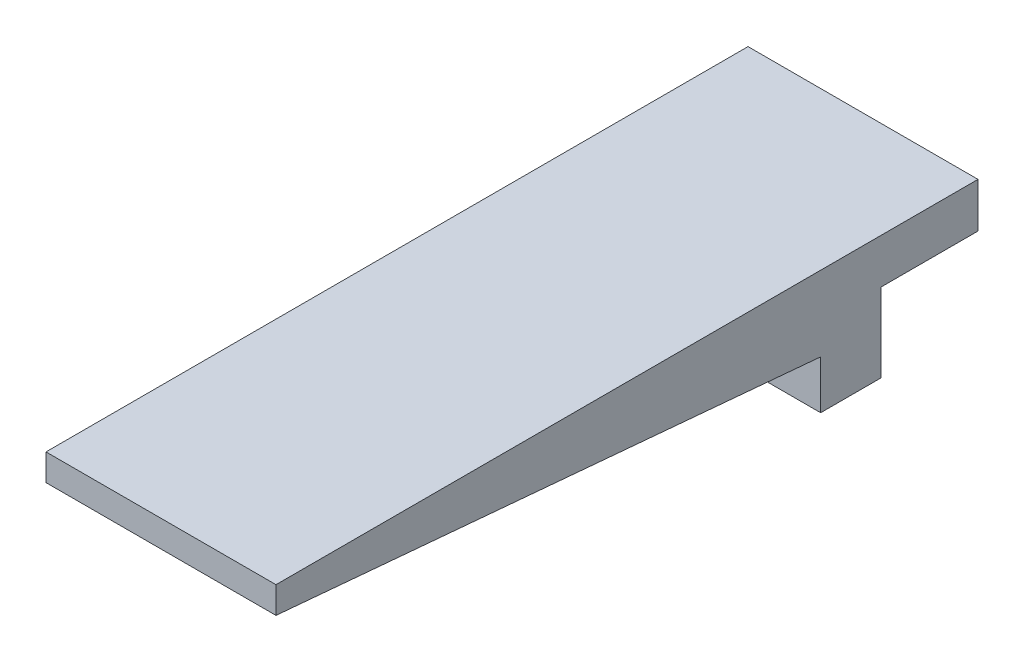
ISO-10303-21;
HEADER;
FILE_DESCRIPTION(('STEP AP214'),'2;1');
FILE_NAME('part.step','',(''),(''),'','','');
FILE_SCHEMA(('AUTOMOTIVE_DESIGN { 1 0 10303 214 1 1 1 1 }'));
ENDSEC;
DATA;
#1=APPLICATION_CONTEXT('core data for automotive mechanical design processes');
#2=APPLICATION_PROTOCOL_DEFINITION('international standard','automotive_design',2000,#1);
#3=PRODUCT_CONTEXT('',#1,'mechanical');
#4=PRODUCT('Part','Part','',(#3));
#5=PRODUCT_RELATED_PRODUCT_CATEGORY('part','',(#4));
#6=PRODUCT_DEFINITION_FORMATION('','',#4);
#7=PRODUCT_DEFINITION_CONTEXT('part definition',#1,'design');
#8=PRODUCT_DEFINITION('design','',#6,#7);
#9=PRODUCT_DEFINITION_SHAPE('','',#8);
#10=(LENGTH_UNIT() NAMED_UNIT(*) SI_UNIT(.MILLI.,.METRE.));
#11=(NAMED_UNIT(*) PLANE_ANGLE_UNIT() SI_UNIT($,.RADIAN.));
#12=(NAMED_UNIT(*) SI_UNIT($,.STERADIAN.) SOLID_ANGLE_UNIT());
#13=UNCERTAINTY_MEASURE_WITH_UNIT(LENGTH_MEASURE(1.E-05),#10,'distance_accuracy_value','');
#14=(GEOMETRIC_REPRESENTATION_CONTEXT(3) GLOBAL_UNCERTAINTY_ASSIGNED_CONTEXT((#13)) GLOBAL_UNIT_ASSIGNED_CONTEXT((#10,
#11,#12)) REPRESENTATION_CONTEXT('',''));
#15=CARTESIAN_POINT('',(0.,0.,0.));
#16=DIRECTION('',(0.,0.,1.));
#17=DIRECTION('',(1.,0.,0.));
#18=AXIS2_PLACEMENT_3D('',#15,#16,#17);
#19=CARTESIAN_POINT('',(9.5,3.25,50.));
#20=DIRECTION('',(-1.,0.,0.));
#21=DIRECTION('',(0.,0.,1.));
#22=AXIS2_PLACEMENT_3D('',#19,#20,#21);
#23=PLANE('',#22);
#24=DIRECTION('',(0.,-0.0885397902837944,-0.996072640692687));
#25=VECTOR('',#24,1.);
#26=CARTESIAN_POINT('',(9.5,4.75,50.));
#27=LINE('',#26,#25);
#28=CARTESIAN_POINT('',(9.5,4.75,50.));
#29=VERTEX_POINT('',#28);
#30=CARTESIAN_POINT('',(9.5,0.75,5.));
#31=VERTEX_POINT('',#30);
#32=EDGE_CURVE('E53',#29,#31,#27,.T.);
#33=ORIENTED_EDGE('',*,*,#32,.T.);
#34=DIRECTION('',(0.,-1.,0.));
#35=VECTOR('',#34,1.);
#36=CARTESIAN_POINT('',(9.5,0.75,5.));
#37=LINE('',#36,#35);
#38=CARTESIAN_POINT('',(9.5,-3.25,5.));
#39=VERTEX_POINT('',#38);
#40=EDGE_CURVE('E105',#31,#39,#37,.T.);
#41=ORIENTED_EDGE('',*,*,#40,.T.);
#42=DIRECTION('',(0.,0.,-1.));
#43=VECTOR('',#42,1.);
#44=CARTESIAN_POINT('',(9.5,-3.25,50.));
#45=LINE('',#44,#43);
#46=CARTESIAN_POINT('',(9.5,-3.25,0.));
#47=VERTEX_POINT('',#46);
#48=EDGE_CURVE('E46',#39,#47,#45,.T.);
#49=ORIENTED_EDGE('',*,*,#48,.T.);
#50=DIRECTION('',(0.,1.,0.));
#51=VECTOR('',#50,1.);
#52=CARTESIAN_POINT('',(9.5,3.25,0.));
#53=LINE('',#52,#51);
#54=CARTESIAN_POINT('',(9.5,3.25,0.));
#55=VERTEX_POINT('',#54);
#56=EDGE_CURVE('E131',#47,#55,#53,.T.);
#57=ORIENTED_EDGE('',*,*,#56,.T.);
#58=DIRECTION('',(0.,0.,-1.));
#59=VECTOR('',#58,1.);
#60=CARTESIAN_POINT('',(9.5,3.25,50.));
#61=LINE('',#60,#59);
#62=CARTESIAN_POINT('',(9.5,3.25,-8.));
#63=VERTEX_POINT('',#62);
#64=EDGE_CURVE('E147',#55,#63,#61,.T.);
#65=ORIENTED_EDGE('',*,*,#64,.T.);
#66=DIRECTION('',(0.,-1.,0.));
#67=VECTOR('',#66,1.);
#68=CARTESIAN_POINT('',(9.5,6.95,-8.));
#69=LINE('',#68,#67);
#70=CARTESIAN_POINT('',(9.5,6.95,-8.));
#71=VERTEX_POINT('',#70);
#72=EDGE_CURVE('E132',#71,#63,#69,.T.);
#73=ORIENTED_EDGE('',*,*,#72,.F.);
#74=DIRECTION('',(0.,0.,-1.));
#75=VECTOR('',#74,1.);
#76=CARTESIAN_POINT('',(9.5,6.95,50.));
#77=LINE('',#76,#75);
#78=CARTESIAN_POINT('',(9.5,6.95,50.));
#79=VERTEX_POINT('',#78);
#80=EDGE_CURVE('E144',#79,#71,#77,.T.);
#81=ORIENTED_EDGE('',*,*,#80,.F.);
#82=DIRECTION('',(0.,1.,0.));
#83=VECTOR('',#82,1.);
#84=CARTESIAN_POINT('',(9.5,3.25,50.));
#85=LINE('',#84,#83);
#86=EDGE_CURVE('E121',#29,#79,#85,.T.);
#87=ORIENTED_EDGE('',*,*,#86,.F.);
#88=EDGE_LOOP('',(#33,#41,#49,#57,#65,#73,#81,#87));
#89=FACE_BOUND('',#88,.T.);
#90=ADVANCED_FACE('F39',(#89),#23,.F.);
#91=CARTESIAN_POINT('',(-9.5,3.25,50.));
#92=DIRECTION('',(1.,0.,0.));
#93=DIRECTION('',(0.,0.,-1.));
#94=AXIS2_PLACEMENT_3D('',#91,#92,#93);
#95=PLANE('',#94);
#96=DIRECTION('',(0.,0.,-1.));
#97=VECTOR('',#96,1.);
#98=CARTESIAN_POINT('',(-9.5,-3.25,50.));
#99=LINE('',#98,#97);
#100=CARTESIAN_POINT('',(-9.5,-3.25,5.));
#101=VERTEX_POINT('',#100);
#102=CARTESIAN_POINT('',(-9.5,-3.25,0.));
#103=VERTEX_POINT('',#102);
#104=EDGE_CURVE('E11',#101,#103,#99,.T.);
#105=ORIENTED_EDGE('',*,*,#104,.F.);
#106=DIRECTION('',(0.,-1.,0.));
#107=VECTOR('',#106,1.);
#108=CARTESIAN_POINT('',(-9.5,0.75,5.));
#109=LINE('',#108,#107);
#110=CARTESIAN_POINT('',(-9.5,0.75,5.));
#111=VERTEX_POINT('',#110);
#112=EDGE_CURVE('E107',#111,#101,#109,.T.);
#113=ORIENTED_EDGE('',*,*,#112,.F.);
#114=DIRECTION('',(0.,-0.0885397902837944,-0.996072640692687));
#115=VECTOR('',#114,1.);
#116=CARTESIAN_POINT('',(-9.5,4.75,50.));
#117=LINE('',#116,#115);
#118=CARTESIAN_POINT('',(-9.5,4.75,50.));
#119=VERTEX_POINT('',#118);
#120=EDGE_CURVE('E113',#119,#111,#117,.T.);
#121=ORIENTED_EDGE('',*,*,#120,.F.);
#122=DIRECTION('',(0.,-1.,0.));
#123=VECTOR('',#122,1.);
#124=CARTESIAN_POINT('',(-9.5,3.25,50.));
#125=LINE('',#124,#123);
#126=CARTESIAN_POINT('',(-9.5,6.95,50.));
#127=VERTEX_POINT('',#126);
#128=EDGE_CURVE('E119',#127,#119,#125,.T.);
#129=ORIENTED_EDGE('',*,*,#128,.F.);
#130=DIRECTION('',(0.,0.,1.));
#131=VECTOR('',#130,1.);
#132=CARTESIAN_POINT('',(-9.5,6.95,50.));
#133=LINE('',#132,#131);
#134=CARTESIAN_POINT('',(-9.5,6.95,-8.));
#135=VERTEX_POINT('',#134);
#136=EDGE_CURVE('E152',#135,#127,#133,.T.);
#137=ORIENTED_EDGE('',*,*,#136,.F.);
#138=DIRECTION('',(0.,-1.,0.));
#139=VECTOR('',#138,1.);
#140=CARTESIAN_POINT('',(-9.5,6.95,-8.));
#141=LINE('',#140,#139);
#142=CARTESIAN_POINT('',(-9.5,3.25,-8.));
#143=VERTEX_POINT('',#142);
#144=EDGE_CURVE('E137',#135,#143,#141,.T.);
#145=ORIENTED_EDGE('',*,*,#144,.T.);
#146=DIRECTION('',(0.,0.,1.));
#147=VECTOR('',#146,1.);
#148=CARTESIAN_POINT('',(-9.5,3.25,50.));
#149=LINE('',#148,#147);
#150=CARTESIAN_POINT('',(-9.5,3.25,0.));
#151=VERTEX_POINT('',#150);
#152=EDGE_CURVE('E141',#143,#151,#149,.T.);
#153=ORIENTED_EDGE('',*,*,#152,.T.);
#154=DIRECTION('',(0.,-1.,0.));
#155=VECTOR('',#154,1.);
#156=CARTESIAN_POINT('',(-9.5,3.25,0.));
#157=LINE('',#156,#155);
#158=EDGE_CURVE('E125',#151,#103,#157,.T.);
#159=ORIENTED_EDGE('',*,*,#158,.T.);
#160=EDGE_LOOP('',(#105,#113,#121,#129,#137,#145,#153,#159));
#161=FACE_BOUND('',#160,.T.);
#162=ADVANCED_FACE('F167',(#161),#95,.F.);
#163=CARTESIAN_POINT('',(-9.5,-3.25,50.));
#164=DIRECTION('',(0.,1.,0.));
#165=DIRECTION('',(0.,0.,1.));
#166=AXIS2_PLACEMENT_3D('',#163,#164,#165);
#167=PLANE('',#166);
#168=ORIENTED_EDGE('',*,*,#48,.F.);
#169=DIRECTION('',(-1.,0.,0.));
#170=VECTOR('',#169,1.);
#171=CARTESIAN_POINT('',(9.5,-3.25,5.));
#172=LINE('',#171,#170);
#173=EDGE_CURVE('E103',#39,#101,#172,.T.);
#174=ORIENTED_EDGE('',*,*,#173,.T.);
#175=ORIENTED_EDGE('',*,*,#104,.T.);
#176=DIRECTION('',(1.,0.,0.));
#177=VECTOR('',#176,1.);
#178=CARTESIAN_POINT('',(-9.5,-3.25,0.));
#179=LINE('',#178,#177);
#180=EDGE_CURVE('E117',#103,#47,#179,.T.);
#181=ORIENTED_EDGE('',*,*,#180,.T.);
#182=EDGE_LOOP('',(#168,#174,#175,#181));
#183=FACE_BOUND('',#182,.T.);
#184=ADVANCED_FACE('F115',(#183),#167,.F.);
#185=CARTESIAN_POINT('',(0.,0.,50.));
#186=DIRECTION('',(0.,0.,1.));
#187=DIRECTION('',(1.,0.,0.));
#188=AXIS2_PLACEMENT_3D('',#185,#186,#187);
#189=PLANE('',#188);
#190=DIRECTION('',(-1.,0.,0.));
#191=VECTOR('',#190,1.);
#192=CARTESIAN_POINT('',(9.5,4.75,50.));
#193=LINE('',#192,#191);
#194=EDGE_CURVE('E110',#29,#119,#193,.T.);
#195=ORIENTED_EDGE('',*,*,#194,.F.);
#196=ORIENTED_EDGE('',*,*,#86,.T.);
#197=DIRECTION('',(1.,0.,0.));
#198=VECTOR('',#197,1.);
#199=CARTESIAN_POINT('',(9.5,6.95,50.));
#200=LINE('',#199,#198);
#201=EDGE_CURVE('E140',#127,#79,#200,.T.);
#202=ORIENTED_EDGE('',*,*,#201,.F.);
#203=ORIENTED_EDGE('',*,*,#128,.T.);
#204=EDGE_LOOP('',(#195,#196,#202,#203));
#205=FACE_BOUND('',#204,.T.);
#206=ADVANCED_FACE('F185',(#205),#189,.T.);
#207=CARTESIAN_POINT('',(0.,0.,0.));
#208=DIRECTION('',(0.,0.,1.));
#209=DIRECTION('',(1.,0.,0.));
#210=AXIS2_PLACEMENT_3D('',#207,#208,#209);
#211=PLANE('',#210);
#212=ORIENTED_EDGE('',*,*,#56,.F.);
#213=ORIENTED_EDGE('',*,*,#180,.F.);
#214=ORIENTED_EDGE('',*,*,#158,.F.);
#215=DIRECTION('',(-1.,0.,0.));
#216=VECTOR('',#215,1.);
#217=CARTESIAN_POINT('',(-9.5,3.25,0.));
#218=LINE('',#217,#216);
#219=EDGE_CURVE('E128',#55,#151,#218,.T.);
#220=ORIENTED_EDGE('',*,*,#219,.F.);
#221=EDGE_LOOP('',(#212,#213,#214,#220));
#222=FACE_BOUND('',#221,.T.);
#223=ADVANCED_FACE('F170',(#222),#211,.F.);
#224=CARTESIAN_POINT('',(0.,3.25,0.));
#225=DIRECTION('',(0.,1.,0.));
#226=DIRECTION('',(0.,0.,1.));
#227=AXIS2_PLACEMENT_3D('',#224,#225,#226);
#228=PLANE('',#227);
#229=ORIENTED_EDGE('',*,*,#64,.F.);
#230=ORIENTED_EDGE('',*,*,#219,.T.);
#231=ORIENTED_EDGE('',*,*,#152,.F.);
#232=DIRECTION('',(-1.,0.,0.));
#233=VECTOR('',#232,1.);
#234=CARTESIAN_POINT('',(9.5,3.25,-8.));
#235=LINE('',#234,#233);
#236=EDGE_CURVE('E145',#63,#143,#235,.T.);
#237=ORIENTED_EDGE('',*,*,#236,.F.);
#238=EDGE_LOOP('',(#229,#230,#231,#237));
#239=FACE_BOUND('',#238,.T.);
#240=ADVANCED_FACE('F175',(#239),#228,.F.);
#241=CARTESIAN_POINT('',(9.5,6.95,-8.));
#242=DIRECTION('',(0.,0.,1.));
#243=DIRECTION('',(1.,0.,0.));
#244=AXIS2_PLACEMENT_3D('',#241,#242,#243);
#245=PLANE('',#244);
#246=ORIENTED_EDGE('',*,*,#236,.T.);
#247=ORIENTED_EDGE('',*,*,#144,.F.);
#248=DIRECTION('',(-1.,0.,0.));
#249=VECTOR('',#248,1.);
#250=CARTESIAN_POINT('',(9.5,6.95,-8.));
#251=LINE('',#250,#249);
#252=EDGE_CURVE('E155',#71,#135,#251,.T.);
#253=ORIENTED_EDGE('',*,*,#252,.F.);
#254=ORIENTED_EDGE('',*,*,#72,.T.);
#255=EDGE_LOOP('',(#246,#247,#253,#254));
#256=FACE_BOUND('',#255,.T.);
#257=ADVANCED_FACE('F178',(#256),#245,.F.);
#258=CARTESIAN_POINT('',(0.,6.95,0.));
#259=DIRECTION('',(0.,1.,0.));
#260=DIRECTION('',(0.,0.,1.));
#261=AXIS2_PLACEMENT_3D('',#258,#259,#260);
#262=PLANE('',#261);
#263=ORIENTED_EDGE('',*,*,#80,.T.);
#264=ORIENTED_EDGE('',*,*,#252,.T.);
#265=ORIENTED_EDGE('',*,*,#136,.T.);
#266=ORIENTED_EDGE('',*,*,#201,.T.);
#267=EDGE_LOOP('',(#263,#264,#265,#266));
#268=FACE_BOUND('',#267,.T.);
#269=ADVANCED_FACE('F181',(#268),#262,.T.);
#270=CARTESIAN_POINT('',(9.5,0.75,5.));
#271=DIRECTION('',(0.,0.,-1.));
#272=DIRECTION('',(-1.,0.,0.));
#273=AXIS2_PLACEMENT_3D('',#270,#271,#272);
#274=PLANE('',#273);
#275=ORIENTED_EDGE('',*,*,#112,.T.);
#276=ORIENTED_EDGE('',*,*,#173,.F.);
#277=ORIENTED_EDGE('',*,*,#40,.F.);
#278=DIRECTION('',(-1.,0.,0.));
#279=VECTOR('',#278,1.);
#280=CARTESIAN_POINT('',(9.5,0.75,5.));
#281=LINE('',#280,#279);
#282=EDGE_CURVE('E149',#31,#111,#281,.T.);
#283=ORIENTED_EDGE('',*,*,#282,.T.);
#284=EDGE_LOOP('',(#275,#276,#277,#283));
#285=FACE_BOUND('',#284,.T.);
#286=ADVANCED_FACE('F104',(#285),#274,.F.);
#287=CARTESIAN_POINT('',(9.5,4.75,50.));
#288=DIRECTION('',(0.,0.996072640692687,-0.0885397902837944));
#289=DIRECTION('',(0.,0.0885397902837944,0.996072640692687));
#290=AXIS2_PLACEMENT_3D('',#287,#288,#289);
#291=PLANE('',#290);
#292=ORIENTED_EDGE('',*,*,#120,.T.);
#293=ORIENTED_EDGE('',*,*,#282,.F.);
#294=ORIENTED_EDGE('',*,*,#32,.F.);
#295=ORIENTED_EDGE('',*,*,#194,.T.);
#296=EDGE_LOOP('',(#292,#293,#294,#295));
#297=FACE_BOUND('',#296,.T.);
#298=ADVANCED_FACE('F165',(#297),#291,.F.);
#299=CLOSED_SHELL('',(#90,#162,#184,#206,#223,#240,#257,#269,#286,#298));
#300=MANIFOLD_SOLID_BREP('B2',#299);
#301=ADVANCED_BREP_SHAPE_REPRESENTATION('',(#18,#300),#14);
#302=SHAPE_DEFINITION_REPRESENTATION(#9,#301);
ENDSEC;
END-ISO-10303-21;
